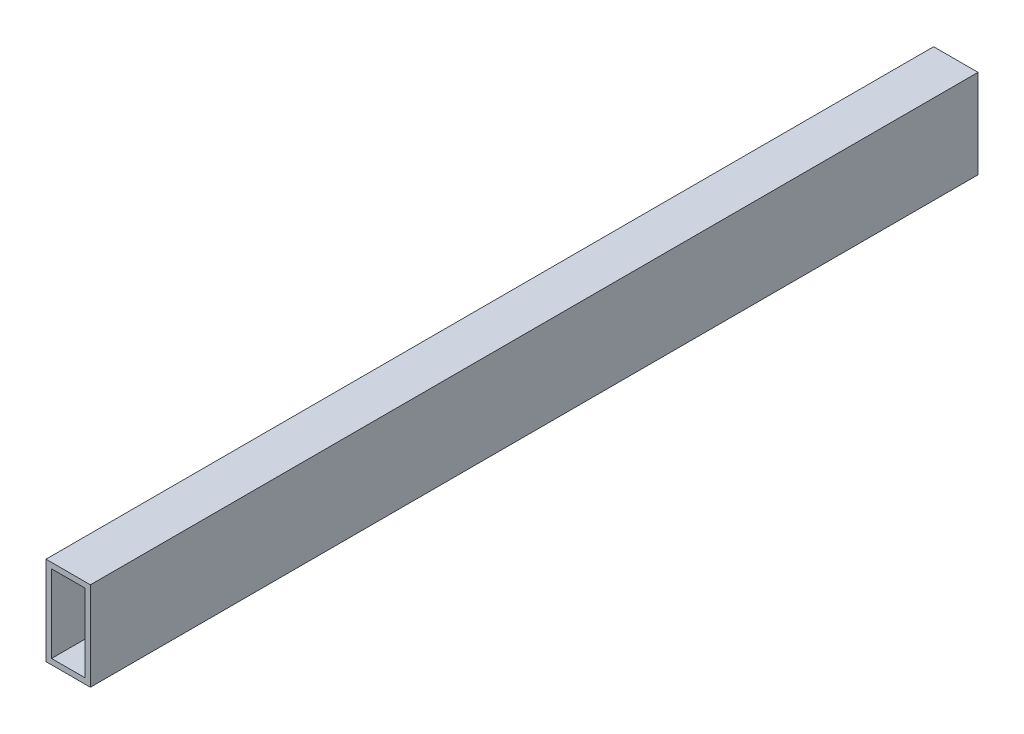
ISO-10303-21;
HEADER;
FILE_DESCRIPTION(('STEP AP214'),'2;1');
FILE_NAME('part.step','',(''),(''),'','','');
FILE_SCHEMA(('AUTOMOTIVE_DESIGN { 1 0 10303 214 1 1 1 1 }'));
ENDSEC;
DATA;
#1=APPLICATION_CONTEXT('core data for automotive mechanical design processes');
#2=APPLICATION_PROTOCOL_DEFINITION('international standard','automotive_design',2000,#1);
#3=PRODUCT_CONTEXT('',#1,'mechanical');
#4=PRODUCT('Part','Part','',(#3));
#5=PRODUCT_RELATED_PRODUCT_CATEGORY('part','',(#4));
#6=PRODUCT_DEFINITION_FORMATION('','',#4);
#7=PRODUCT_DEFINITION_CONTEXT('part definition',#1,'design');
#8=PRODUCT_DEFINITION('design','',#6,#7);
#9=PRODUCT_DEFINITION_SHAPE('','',#8);
#10=(LENGTH_UNIT() NAMED_UNIT(*) SI_UNIT(.MILLI.,.METRE.));
#11=(NAMED_UNIT(*) PLANE_ANGLE_UNIT() SI_UNIT($,.RADIAN.));
#12=(NAMED_UNIT(*) SI_UNIT($,.STERADIAN.) SOLID_ANGLE_UNIT());
#13=UNCERTAINTY_MEASURE_WITH_UNIT(LENGTH_MEASURE(1.E-05),#10,'distance_accuracy_value','');
#14=(GEOMETRIC_REPRESENTATION_CONTEXT(3) GLOBAL_UNCERTAINTY_ASSIGNED_CONTEXT((#13)) GLOBAL_UNIT_ASSIGNED_CONTEXT((#10,
#11,#12)) REPRESENTATION_CONTEXT('',''));
#15=CARTESIAN_POINT('',(0.,0.,0.));
#16=DIRECTION('',(0.,0.,1.));
#17=DIRECTION('',(1.,0.,0.));
#18=AXIS2_PLACEMENT_3D('',#15,#16,#17);
#19=CARTESIAN_POINT('',(0.,0.,508.));
#20=DIRECTION('',(0.,0.,1.));
#21=DIRECTION('',(1.,0.,0.));
#22=AXIS2_PLACEMENT_3D('',#19,#20,#21);
#23=PLANE('',#22);
#24=DIRECTION('',(0.,1.,0.));
#25=VECTOR('',#24,1.);
#26=CARTESIAN_POINT('',(0.,0.,508.));
#27=LINE('',#26,#25);
#28=CARTESIAN_POINT('',(0.,0.,508.));
#29=VERTEX_POINT('',#28);
#30=CARTESIAN_POINT('',(0.,50.8,508.));
#31=VERTEX_POINT('',#30);
#32=EDGE_CURVE('E153',#29,#31,#27,.T.);
#33=ORIENTED_EDGE('',*,*,#32,.T.);
#34=DIRECTION('',(-1.,0.,0.));
#35=VECTOR('',#34,1.);
#36=CARTESIAN_POINT('',(0.,50.8,508.));
#37=LINE('',#36,#35);
#38=CARTESIAN_POINT('',(-25.4,50.8,508.));
#39=VERTEX_POINT('',#38);
#40=EDGE_CURVE('E157',#31,#39,#37,.T.);
#41=ORIENTED_EDGE('',*,*,#40,.T.);
#42=DIRECTION('',(0.,-1.,0.));
#43=VECTOR('',#42,1.);
#44=CARTESIAN_POINT('',(-25.4,0.,508.));
#45=LINE('',#44,#43);
#46=CARTESIAN_POINT('',(-25.4,0.,508.));
#47=VERTEX_POINT('',#46);
#48=EDGE_CURVE('E161',#39,#47,#45,.T.);
#49=ORIENTED_EDGE('',*,*,#48,.T.);
#50=DIRECTION('',(1.,0.,0.));
#51=VECTOR('',#50,1.);
#52=CARTESIAN_POINT('',(0.,0.,508.));
#53=LINE('',#52,#51);
#54=EDGE_CURVE('E164',#47,#29,#53,.T.);
#55=ORIENTED_EDGE('',*,*,#54,.T.);
#56=EDGE_LOOP('',(#33,#41,#49,#55));
#57=FACE_BOUND('',#56,.T.);
#58=DIRECTION('',(-1.,0.,0.));
#59=VECTOR('',#58,1.);
#60=CARTESIAN_POINT('',(-3.175,47.625,508.));
#61=LINE('',#60,#59);
#62=CARTESIAN_POINT('',(-3.175,47.625,508.));
#63=VERTEX_POINT('',#62);
#64=CARTESIAN_POINT('',(-22.225,47.625,508.));
#65=VERTEX_POINT('',#64);
#66=EDGE_CURVE('E114',#63,#65,#61,.T.);
#67=ORIENTED_EDGE('',*,*,#66,.F.);
#68=DIRECTION('',(0.,1.,0.));
#69=VECTOR('',#68,1.);
#70=CARTESIAN_POINT('',(-3.175,3.175,508.));
#71=LINE('',#70,#69);
#72=CARTESIAN_POINT('',(-3.175,3.175,508.));
#73=VERTEX_POINT('',#72);
#74=EDGE_CURVE('E105',#73,#63,#71,.T.);
#75=ORIENTED_EDGE('',*,*,#74,.F.);
#76=DIRECTION('',(1.,0.,0.));
#77=VECTOR('',#76,1.);
#78=CARTESIAN_POINT('',(-3.175,3.175,508.));
#79=LINE('',#78,#77);
#80=CARTESIAN_POINT('',(-22.225,3.175,508.));
#81=VERTEX_POINT('',#80);
#82=EDGE_CURVE('E131',#81,#73,#79,.T.);
#83=ORIENTED_EDGE('',*,*,#82,.F.);
#84=DIRECTION('',(0.,-1.,0.));
#85=VECTOR('',#84,1.);
#86=CARTESIAN_POINT('',(-22.225,3.175,508.));
#87=LINE('',#86,#85);
#88=EDGE_CURVE('E127',#65,#81,#87,.T.);
#89=ORIENTED_EDGE('',*,*,#88,.F.);
#90=EDGE_LOOP('',(#67,#75,#83,#89));
#91=FACE_BOUND('',#90,.T.);
#92=ADVANCED_FACE('F39',(#57,#91),#23,.T.);
#93=CARTESIAN_POINT('',(0.,0.,0.));
#94=DIRECTION('',(0.,0.,1.));
#95=DIRECTION('',(1.,0.,0.));
#96=AXIS2_PLACEMENT_3D('',#93,#94,#95);
#97=PLANE('',#96);
#98=DIRECTION('',(0.,1.,0.));
#99=VECTOR('',#98,1.);
#100=CARTESIAN_POINT('',(0.,0.,0.));
#101=LINE('',#100,#99);
#102=CARTESIAN_POINT('',(0.,0.,0.));
#103=VERTEX_POINT('',#102);
#104=CARTESIAN_POINT('',(0.,50.8,0.));
#105=VERTEX_POINT('',#104);
#106=EDGE_CURVE('E123',#103,#105,#101,.T.);
#107=ORIENTED_EDGE('',*,*,#106,.F.);
#108=DIRECTION('',(1.,0.,0.));
#109=VECTOR('',#108,1.);
#110=CARTESIAN_POINT('',(0.,0.,0.));
#111=LINE('',#110,#109);
#112=CARTESIAN_POINT('',(-25.4,0.,0.));
#113=VERTEX_POINT('',#112);
#114=EDGE_CURVE('E158',#113,#103,#111,.T.);
#115=ORIENTED_EDGE('',*,*,#114,.F.);
#116=DIRECTION('',(0.,-1.,0.));
#117=VECTOR('',#116,1.);
#118=CARTESIAN_POINT('',(-25.4,0.,0.));
#119=LINE('',#118,#117);
#120=CARTESIAN_POINT('',(-25.4,50.8,0.));
#121=VERTEX_POINT('',#120);
#122=EDGE_CURVE('E174',#121,#113,#119,.T.);
#123=ORIENTED_EDGE('',*,*,#122,.F.);
#124=DIRECTION('',(-1.,0.,0.));
#125=VECTOR('',#124,1.);
#126=CARTESIAN_POINT('',(0.,50.8,0.));
#127=LINE('',#126,#125);
#128=EDGE_CURVE('E171',#105,#121,#127,.T.);
#129=ORIENTED_EDGE('',*,*,#128,.F.);
#130=EDGE_LOOP('',(#107,#115,#123,#129));
#131=FACE_BOUND('',#130,.T.);
#132=DIRECTION('',(0.,1.,0.));
#133=VECTOR('',#132,1.);
#134=CARTESIAN_POINT('',(-3.175,3.175,0.));
#135=LINE('',#134,#133);
#136=CARTESIAN_POINT('',(-3.175,3.175,0.));
#137=VERTEX_POINT('',#136);
#138=CARTESIAN_POINT('',(-3.175,47.625,0.));
#139=VERTEX_POINT('',#138);
#140=EDGE_CURVE('E63',#137,#139,#135,.T.);
#141=ORIENTED_EDGE('',*,*,#140,.T.);
#142=DIRECTION('',(-1.,0.,0.));
#143=VECTOR('',#142,1.);
#144=CARTESIAN_POINT('',(-3.175,47.625,0.));
#145=LINE('',#144,#143);
#146=CARTESIAN_POINT('',(-22.225,47.625,0.));
#147=VERTEX_POINT('',#146);
#148=EDGE_CURVE('E121',#139,#147,#145,.T.);
#149=ORIENTED_EDGE('',*,*,#148,.T.);
#150=DIRECTION('',(0.,-1.,0.));
#151=VECTOR('',#150,1.);
#152=CARTESIAN_POINT('',(-22.225,3.175,0.));
#153=LINE('',#152,#151);
#154=CARTESIAN_POINT('',(-22.225,3.175,0.));
#155=VERTEX_POINT('',#154);
#156=EDGE_CURVE('E140',#147,#155,#153,.T.);
#157=ORIENTED_EDGE('',*,*,#156,.T.);
#158=DIRECTION('',(1.,0.,0.));
#159=VECTOR('',#158,1.);
#160=CARTESIAN_POINT('',(-3.175,3.175,0.));
#161=LINE('',#160,#159);
#162=EDGE_CURVE('E115',#155,#137,#161,.T.);
#163=ORIENTED_EDGE('',*,*,#162,.T.);
#164=EDGE_LOOP('',(#141,#149,#157,#163));
#165=FACE_BOUND('',#164,.T.);
#166=ADVANCED_FACE('F197',(#131,#165),#97,.F.);
#167=CARTESIAN_POINT('',(0.,0.,508.));
#168=DIRECTION('',(-1.,0.,0.));
#169=DIRECTION('',(0.,0.,1.));
#170=AXIS2_PLACEMENT_3D('',#167,#168,#169);
#171=PLANE('',#170);
#172=ORIENTED_EDGE('',*,*,#106,.T.);
#173=DIRECTION('',(0.,0.,-1.));
#174=VECTOR('',#173,1.);
#175=CARTESIAN_POINT('',(0.,50.8,508.));
#176=LINE('',#175,#174);
#177=EDGE_CURVE('E11',#31,#105,#176,.T.);
#178=ORIENTED_EDGE('',*,*,#177,.F.);
#179=ORIENTED_EDGE('',*,*,#32,.F.);
#180=DIRECTION('',(0.,0.,-1.));
#181=VECTOR('',#180,1.);
#182=CARTESIAN_POINT('',(0.,0.,508.));
#183=LINE('',#182,#181);
#184=EDGE_CURVE('E167',#29,#103,#183,.T.);
#185=ORIENTED_EDGE('',*,*,#184,.T.);
#186=EDGE_LOOP('',(#172,#178,#179,#185));
#187=FACE_BOUND('',#186,.T.);
#188=ADVANCED_FACE('F41',(#187),#171,.F.);
#189=CARTESIAN_POINT('',(0.,50.8,508.));
#190=DIRECTION('',(0.,-1.,0.));
#191=DIRECTION('',(0.,0.,-1.));
#192=AXIS2_PLACEMENT_3D('',#189,#190,#191);
#193=PLANE('',#192);
#194=ORIENTED_EDGE('',*,*,#128,.T.);
#195=DIRECTION('',(0.,0.,-1.));
#196=VECTOR('',#195,1.);
#197=CARTESIAN_POINT('',(-25.4,50.8,508.));
#198=LINE('',#197,#196);
#199=EDGE_CURVE('E48',#39,#121,#198,.T.);
#200=ORIENTED_EDGE('',*,*,#199,.F.);
#201=ORIENTED_EDGE('',*,*,#40,.F.);
#202=ORIENTED_EDGE('',*,*,#177,.T.);
#203=EDGE_LOOP('',(#194,#200,#201,#202));
#204=FACE_BOUND('',#203,.T.);
#205=ADVANCED_FACE('F207',(#204),#193,.F.);
#206=CARTESIAN_POINT('',(-25.4,0.,508.));
#207=DIRECTION('',(1.,0.,0.));
#208=DIRECTION('',(0.,0.,-1.));
#209=AXIS2_PLACEMENT_3D('',#206,#207,#208);
#210=PLANE('',#209);
#211=ORIENTED_EDGE('',*,*,#122,.T.);
#212=DIRECTION('',(0.,0.,-1.));
#213=VECTOR('',#212,1.);
#214=CARTESIAN_POINT('',(-25.4,0.,508.));
#215=LINE('',#214,#213);
#216=EDGE_CURVE('E182',#47,#113,#215,.T.);
#217=ORIENTED_EDGE('',*,*,#216,.F.);
#218=ORIENTED_EDGE('',*,*,#48,.F.);
#219=ORIENTED_EDGE('',*,*,#199,.T.);
#220=EDGE_LOOP('',(#211,#217,#218,#219));
#221=FACE_BOUND('',#220,.T.);
#222=ADVANCED_FACE('F191',(#221),#210,.F.);
#223=CARTESIAN_POINT('',(0.,0.,508.));
#224=DIRECTION('',(0.,1.,0.));
#225=DIRECTION('',(0.,0.,1.));
#226=AXIS2_PLACEMENT_3D('',#223,#224,#225);
#227=PLANE('',#226);
#228=ORIENTED_EDGE('',*,*,#114,.T.);
#229=ORIENTED_EDGE('',*,*,#184,.F.);
#230=ORIENTED_EDGE('',*,*,#54,.F.);
#231=ORIENTED_EDGE('',*,*,#216,.T.);
#232=EDGE_LOOP('',(#228,#229,#230,#231));
#233=FACE_BOUND('',#232,.T.);
#234=ADVANCED_FACE('F201',(#233),#227,.F.);
#235=CARTESIAN_POINT('',(-3.175,3.175,508.));
#236=DIRECTION('',(-1.,0.,0.));
#237=DIRECTION('',(0.,0.,1.));
#238=AXIS2_PLACEMENT_3D('',#235,#236,#237);
#239=PLANE('',#238);
#240=ORIENTED_EDGE('',*,*,#140,.F.);
#241=DIRECTION('',(0.,0.,-1.));
#242=VECTOR('',#241,1.);
#243=CARTESIAN_POINT('',(-3.175,3.175,508.));
#244=LINE('',#243,#242);
#245=EDGE_CURVE('E109',#73,#137,#244,.T.);
#246=ORIENTED_EDGE('',*,*,#245,.F.);
#247=ORIENTED_EDGE('',*,*,#74,.T.);
#248=DIRECTION('',(0.,0.,-1.));
#249=VECTOR('',#248,1.);
#250=CARTESIAN_POINT('',(-3.175,47.625,508.));
#251=LINE('',#250,#249);
#252=EDGE_CURVE('E108',#63,#139,#251,.T.);
#253=ORIENTED_EDGE('',*,*,#252,.T.);
#254=EDGE_LOOP('',(#240,#246,#247,#253));
#255=FACE_BOUND('',#254,.T.);
#256=ADVANCED_FACE('F107',(#255),#239,.T.);
#257=CARTESIAN_POINT('',(-3.175,47.625,508.));
#258=DIRECTION('',(0.,-1.,0.));
#259=DIRECTION('',(0.,0.,-1.));
#260=AXIS2_PLACEMENT_3D('',#257,#258,#259);
#261=PLANE('',#260);
#262=ORIENTED_EDGE('',*,*,#148,.F.);
#263=ORIENTED_EDGE('',*,*,#252,.F.);
#264=ORIENTED_EDGE('',*,*,#66,.T.);
#265=DIRECTION('',(0.,0.,-1.));
#266=VECTOR('',#265,1.);
#267=CARTESIAN_POINT('',(-22.225,47.625,508.));
#268=LINE('',#267,#266);
#269=EDGE_CURVE('E124',#65,#147,#268,.T.);
#270=ORIENTED_EDGE('',*,*,#269,.T.);
#271=EDGE_LOOP('',(#262,#263,#264,#270));
#272=FACE_BOUND('',#271,.T.);
#273=ADVANCED_FACE('F118',(#272),#261,.T.);
#274=CARTESIAN_POINT('',(-22.225,3.175,508.));
#275=DIRECTION('',(1.,0.,0.));
#276=DIRECTION('',(0.,1.,0.));
#277=AXIS2_PLACEMENT_3D('',#274,#275,#276);
#278=PLANE('',#277);
#279=ORIENTED_EDGE('',*,*,#156,.F.);
#280=ORIENTED_EDGE('',*,*,#269,.F.);
#281=ORIENTED_EDGE('',*,*,#88,.T.);
#282=DIRECTION('',(0.,0.,-1.));
#283=VECTOR('',#282,1.);
#284=CARTESIAN_POINT('',(-22.225,3.175,508.));
#285=LINE('',#284,#283);
#286=EDGE_CURVE('E55',#81,#155,#285,.T.);
#287=ORIENTED_EDGE('',*,*,#286,.T.);
#288=EDGE_LOOP('',(#279,#280,#281,#287));
#289=FACE_BOUND('',#288,.T.);
#290=ADVANCED_FACE('F230',(#289),#278,.T.);
#291=CARTESIAN_POINT('',(-3.175,3.175,508.));
#292=DIRECTION('',(0.,1.,0.));
#293=DIRECTION('',(-1.,0.,0.));
#294=AXIS2_PLACEMENT_3D('',#291,#292,#293);
#295=PLANE('',#294);
#296=ORIENTED_EDGE('',*,*,#162,.F.);
#297=ORIENTED_EDGE('',*,*,#286,.F.);
#298=ORIENTED_EDGE('',*,*,#82,.T.);
#299=ORIENTED_EDGE('',*,*,#245,.T.);
#300=EDGE_LOOP('',(#296,#297,#298,#299));
#301=FACE_BOUND('',#300,.T.);
#302=ADVANCED_FACE('F234',(#301),#295,.T.);
#303=CLOSED_SHELL('',(#92,#166,#188,#205,#222,#234,#256,#273,#290,#302));
#304=MANIFOLD_SOLID_BREP('B2',#303);
#305=ADVANCED_BREP_SHAPE_REPRESENTATION('',(#18,#304),#14);
#306=SHAPE_DEFINITION_REPRESENTATION(#9,#305);
ENDSEC;
END-ISO-10303-21;
